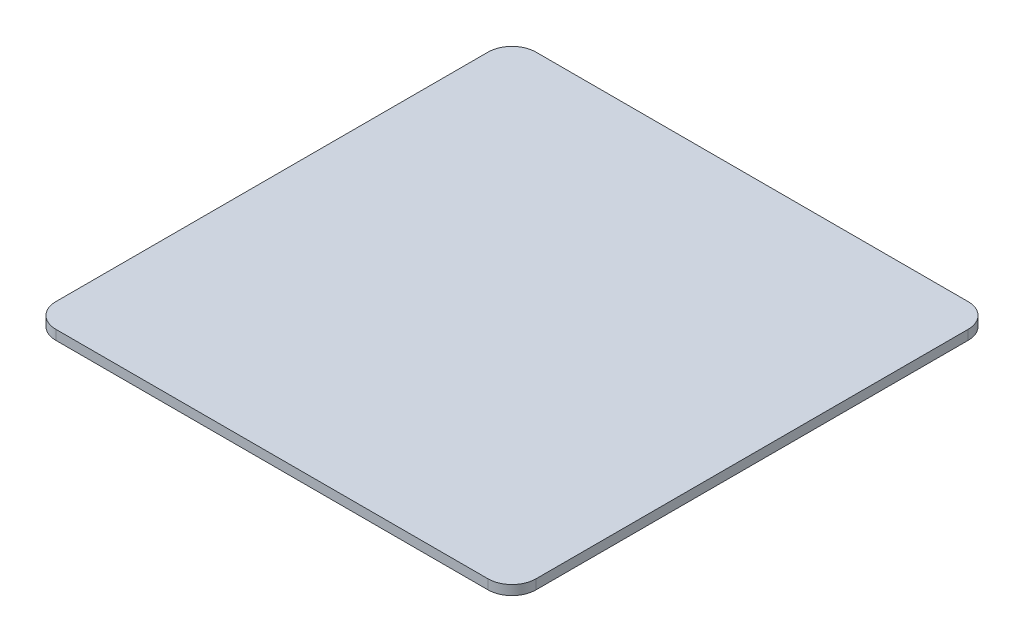
ISO-10303-21;
HEADER;
FILE_DESCRIPTION(('STEP AP214'),'2;1');
FILE_NAME('part.step','',(''),(''),'','','');
FILE_SCHEMA(('AUTOMOTIVE_DESIGN { 1 0 10303 214 1 1 1 1 }'));
ENDSEC;
DATA;
#1=APPLICATION_CONTEXT('core data for automotive mechanical design processes');
#2=APPLICATION_PROTOCOL_DEFINITION('international standard','automotive_design',2000,#1);
#3=PRODUCT_CONTEXT('',#1,'mechanical');
#4=PRODUCT('Part','Part','',(#3));
#5=PRODUCT_RELATED_PRODUCT_CATEGORY('part','',(#4));
#6=PRODUCT_DEFINITION_FORMATION('','',#4);
#7=PRODUCT_DEFINITION_CONTEXT('part definition',#1,'design');
#8=PRODUCT_DEFINITION('design','',#6,#7);
#9=PRODUCT_DEFINITION_SHAPE('','',#8);
#10=(LENGTH_UNIT() NAMED_UNIT(*) SI_UNIT(.MILLI.,.METRE.));
#11=(NAMED_UNIT(*) PLANE_ANGLE_UNIT() SI_UNIT($,.RADIAN.));
#12=(NAMED_UNIT(*) SI_UNIT($,.STERADIAN.) SOLID_ANGLE_UNIT());
#13=UNCERTAINTY_MEASURE_WITH_UNIT(LENGTH_MEASURE(1.E-05),#10,'distance_accuracy_value','');
#14=(GEOMETRIC_REPRESENTATION_CONTEXT(3) GLOBAL_UNCERTAINTY_ASSIGNED_CONTEXT((#13)) GLOBAL_UNIT_ASSIGNED_CONTEXT((#10,
#11,#12)) REPRESENTATION_CONTEXT('',''));
#15=CARTESIAN_POINT('',(0.,0.,0.));
#16=DIRECTION('',(0.,0.,1.));
#17=DIRECTION('',(1.,0.,0.));
#18=AXIS2_PLACEMENT_3D('',#15,#16,#17);
#19=CARTESIAN_POINT('',(25.,1.,25.));
#20=DIRECTION('',(-1.,0.,0.));
#21=DIRECTION('',(0.,0.,1.));
#22=AXIS2_PLACEMENT_3D('',#19,#20,#21);
#23=PLANE('',#22);
#24=DIRECTION('',(0.,0.,-1.));
#25=VECTOR('',#24,1.);
#26=CARTESIAN_POINT('',(25.,0.,25.));
#27=LINE('',#26,#25);
#28=CARTESIAN_POINT('',(25.,0.,22.5));
#29=VERTEX_POINT('',#28);
#30=CARTESIAN_POINT('',(25.,0.,-22.5));
#31=VERTEX_POINT('',#30);
#32=EDGE_CURVE('E140',#29,#31,#27,.T.);
#33=ORIENTED_EDGE('',*,*,#32,.T.);
#34=DIRECTION('',(0.,-1.,0.));
#35=VECTOR('',#34,1.);
#36=CARTESIAN_POINT('',(25.,1.,-22.5));
#37=LINE('',#36,#35);
#38=CARTESIAN_POINT('',(25.,1.,-22.5));
#39=VERTEX_POINT('',#38);
#40=EDGE_CURVE('E174',#31,#39,#37,.F.);
#41=ORIENTED_EDGE('',*,*,#40,.T.);
#42=DIRECTION('',(0.,0.,-1.));
#43=VECTOR('',#42,1.);
#44=CARTESIAN_POINT('',(25.,1.,25.));
#45=LINE('',#44,#43);
#46=CARTESIAN_POINT('',(25.,1.,22.5));
#47=VERTEX_POINT('',#46);
#48=EDGE_CURVE('E138',#47,#39,#45,.T.);
#49=ORIENTED_EDGE('',*,*,#48,.F.);
#50=DIRECTION('',(0.,-1.,0.));
#51=VECTOR('',#50,1.);
#52=CARTESIAN_POINT('',(25.,1.,22.5));
#53=LINE('',#52,#51);
#54=EDGE_CURVE('E170',#47,#29,#53,.T.);
#55=ORIENTED_EDGE('',*,*,#54,.T.);
#56=EDGE_LOOP('',(#33,#41,#49,#55));
#57=FACE_BOUND('',#56,.T.);
#58=ADVANCED_FACE('F39',(#57),#23,.F.);
#59=CARTESIAN_POINT('',(-25.,1.,-25.));
#60=DIRECTION('',(0.,0.,1.));
#61=DIRECTION('',(1.,0.,0.));
#62=AXIS2_PLACEMENT_3D('',#59,#60,#61);
#63=PLANE('',#62);
#64=DIRECTION('',(-1.,0.,0.));
#65=VECTOR('',#64,1.);
#66=CARTESIAN_POINT('',(-25.,0.,-25.));
#67=LINE('',#66,#65);
#68=CARTESIAN_POINT('',(22.5,0.,-25.));
#69=VERTEX_POINT('',#68);
#70=CARTESIAN_POINT('',(-22.5,0.,-25.));
#71=VERTEX_POINT('',#70);
#72=EDGE_CURVE('E134',#69,#71,#67,.T.);
#73=ORIENTED_EDGE('',*,*,#72,.T.);
#74=DIRECTION('',(0.,-1.,0.));
#75=VECTOR('',#74,1.);
#76=CARTESIAN_POINT('',(-22.5,1.,-25.));
#77=LINE('',#76,#75);
#78=CARTESIAN_POINT('',(-22.5,1.,-25.));
#79=VERTEX_POINT('',#78);
#80=EDGE_CURVE('E110',#71,#79,#77,.F.);
#81=ORIENTED_EDGE('',*,*,#80,.T.);
#82=DIRECTION('',(-1.,0.,0.));
#83=VECTOR('',#82,1.);
#84=CARTESIAN_POINT('',(-25.,1.,-25.));
#85=LINE('',#84,#83);
#86=CARTESIAN_POINT('',(22.5,1.,-25.));
#87=VERTEX_POINT('',#86);
#88=EDGE_CURVE('E193',#87,#79,#85,.T.);
#89=ORIENTED_EDGE('',*,*,#88,.F.);
#90=DIRECTION('',(0.,-1.,0.));
#91=VECTOR('',#90,1.);
#92=CARTESIAN_POINT('',(22.5,1.,-25.));
#93=LINE('',#92,#91);
#94=EDGE_CURVE('E116',#87,#69,#93,.T.);
#95=ORIENTED_EDGE('',*,*,#94,.T.);
#96=EDGE_LOOP('',(#73,#81,#89,#95));
#97=FACE_BOUND('',#96,.T.);
#98=ADVANCED_FACE('F214',(#97),#63,.F.);
#99=CARTESIAN_POINT('',(-25.,1.,25.));
#100=DIRECTION('',(1.,0.,0.));
#101=DIRECTION('',(0.,0.,-1.));
#102=AXIS2_PLACEMENT_3D('',#99,#100,#101);
#103=PLANE('',#102);
#104=DIRECTION('',(0.,0.,1.));
#105=VECTOR('',#104,1.);
#106=CARTESIAN_POINT('',(-25.,1.,25.));
#107=LINE('',#106,#105);
#108=CARTESIAN_POINT('',(-25.,1.,-22.5));
#109=VERTEX_POINT('',#108);
#110=CARTESIAN_POINT('',(-25.,1.,22.5));
#111=VERTEX_POINT('',#110);
#112=EDGE_CURVE('E125',#109,#111,#107,.T.);
#113=ORIENTED_EDGE('',*,*,#112,.F.);
#114=DIRECTION('',(0.,-1.,0.));
#115=VECTOR('',#114,1.);
#116=CARTESIAN_POINT('',(-25.,1.,-22.5));
#117=LINE('',#116,#115);
#118=CARTESIAN_POINT('',(-25.,0.,-22.5));
#119=VERTEX_POINT('',#118);
#120=EDGE_CURVE('E109',#109,#119,#117,.T.);
#121=ORIENTED_EDGE('',*,*,#120,.T.);
#122=DIRECTION('',(0.,0.,1.));
#123=VECTOR('',#122,1.);
#124=CARTESIAN_POINT('',(-25.,0.,25.));
#125=LINE('',#124,#123);
#126=CARTESIAN_POINT('',(-25.,0.,22.5));
#127=VERTEX_POINT('',#126);
#128=EDGE_CURVE('E123',#119,#127,#125,.T.);
#129=ORIENTED_EDGE('',*,*,#128,.T.);
#130=DIRECTION('',(0.,-1.,0.));
#131=VECTOR('',#130,1.);
#132=CARTESIAN_POINT('',(-25.,1.,22.5));
#133=LINE('',#132,#131);
#134=EDGE_CURVE('E128',#127,#111,#133,.F.);
#135=ORIENTED_EDGE('',*,*,#134,.T.);
#136=EDGE_LOOP('',(#113,#121,#129,#135));
#137=FACE_BOUND('',#136,.T.);
#138=ADVANCED_FACE('F122',(#137),#103,.F.);
#139=CARTESIAN_POINT('',(-25.,1.,25.));
#140=DIRECTION('',(0.,0.,-1.));
#141=DIRECTION('',(-1.,0.,0.));
#142=AXIS2_PLACEMENT_3D('',#139,#140,#141);
#143=PLANE('',#142);
#144=DIRECTION('',(1.,0.,0.));
#145=VECTOR('',#144,1.);
#146=CARTESIAN_POINT('',(-25.,0.,25.));
#147=LINE('',#146,#145);
#148=CARTESIAN_POINT('',(-22.5,0.,25.));
#149=VERTEX_POINT('',#148);
#150=CARTESIAN_POINT('',(22.5,0.,25.));
#151=VERTEX_POINT('',#150);
#152=EDGE_CURVE('E133',#149,#151,#147,.T.);
#153=ORIENTED_EDGE('',*,*,#152,.T.);
#154=DIRECTION('',(0.,-1.,0.));
#155=VECTOR('',#154,1.);
#156=CARTESIAN_POINT('',(22.5,1.,25.));
#157=LINE('',#156,#155);
#158=CARTESIAN_POINT('',(22.5,1.,25.));
#159=VERTEX_POINT('',#158);
#160=EDGE_CURVE('E11',#151,#159,#157,.F.);
#161=ORIENTED_EDGE('',*,*,#160,.T.);
#162=DIRECTION('',(1.,0.,0.));
#163=VECTOR('',#162,1.);
#164=CARTESIAN_POINT('',(-25.,1.,25.));
#165=LINE('',#164,#163);
#166=CARTESIAN_POINT('',(-22.5,1.,25.));
#167=VERTEX_POINT('',#166);
#168=EDGE_CURVE('E145',#167,#159,#165,.T.);
#169=ORIENTED_EDGE('',*,*,#168,.F.);
#170=DIRECTION('',(0.,-1.,0.));
#171=VECTOR('',#170,1.);
#172=CARTESIAN_POINT('',(-22.5,1.,25.));
#173=LINE('',#172,#171);
#174=EDGE_CURVE('E48',#167,#149,#173,.T.);
#175=ORIENTED_EDGE('',*,*,#174,.T.);
#176=EDGE_LOOP('',(#153,#161,#169,#175));
#177=FACE_BOUND('',#176,.T.);
#178=ADVANCED_FACE('F179',(#177),#143,.F.);
#179=CARTESIAN_POINT('',(0.,1.,0.));
#180=DIRECTION('',(0.,-1.,0.));
#181=DIRECTION('',(0.,0.,-1.));
#182=AXIS2_PLACEMENT_3D('',#179,#180,#181);
#183=PLANE('',#182);
#184=ORIENTED_EDGE('',*,*,#88,.T.);
#185=CARTESIAN_POINT('',(-22.5,1.,-22.5));
#186=DIRECTION('',(0.,-1.,0.));
#187=DIRECTION('',(0.,0.,-1.));
#188=AXIS2_PLACEMENT_3D('',#185,#186,#187);
#189=CIRCLE('',#188,2.5);
#190=EDGE_CURVE('E167',#79,#109,#189,.F.);
#191=ORIENTED_EDGE('',*,*,#190,.T.);
#192=ORIENTED_EDGE('',*,*,#112,.T.);
#193=CARTESIAN_POINT('',(-22.5,1.,22.5));
#194=DIRECTION('',(0.,-1.,0.));
#195=DIRECTION('',(0.,0.,-1.));
#196=AXIS2_PLACEMENT_3D('',#193,#194,#195);
#197=CIRCLE('',#196,2.5);
#198=EDGE_CURVE('E60',#111,#167,#197,.F.);
#199=ORIENTED_EDGE('',*,*,#198,.T.);
#200=ORIENTED_EDGE('',*,*,#168,.T.);
#201=CARTESIAN_POINT('',(22.5,1.,22.5));
#202=DIRECTION('',(0.,-1.,0.));
#203=DIRECTION('',(0.,0.,-1.));
#204=AXIS2_PLACEMENT_3D('',#201,#202,#203);
#205=CIRCLE('',#204,2.5);
#206=EDGE_CURVE('E161',#159,#47,#205,.F.);
#207=ORIENTED_EDGE('',*,*,#206,.T.);
#208=ORIENTED_EDGE('',*,*,#48,.T.);
#209=CARTESIAN_POINT('',(22.5,1.,-22.5));
#210=DIRECTION('',(0.,-1.,0.));
#211=DIRECTION('',(0.,0.,-1.));
#212=AXIS2_PLACEMENT_3D('',#209,#210,#211);
#213=CIRCLE('',#212,2.5);
#214=EDGE_CURVE('E164',#39,#87,#213,.F.);
#215=ORIENTED_EDGE('',*,*,#214,.T.);
#216=EDGE_LOOP('',(#184,#191,#192,#199,#200,#207,#208,#215));
#217=FACE_BOUND('',#216,.T.);
#218=ADVANCED_FACE('F203',(#217),#183,.F.);
#219=CARTESIAN_POINT('',(0.,0.,0.));
#220=DIRECTION('',(0.,-1.,0.));
#221=DIRECTION('',(0.,0.,-1.));
#222=AXIS2_PLACEMENT_3D('',#219,#220,#221);
#223=PLANE('',#222);
#224=ORIENTED_EDGE('',*,*,#128,.F.);
#225=CARTESIAN_POINT('',(-22.5,0.,-22.5));
#226=DIRECTION('',(0.,-1.,0.));
#227=DIRECTION('',(0.,0.,-1.));
#228=AXIS2_PLACEMENT_3D('',#225,#226,#227);
#229=CIRCLE('',#228,2.5);
#230=EDGE_CURVE('E105',#119,#71,#229,.T.);
#231=ORIENTED_EDGE('',*,*,#230,.T.);
#232=ORIENTED_EDGE('',*,*,#72,.F.);
#233=CARTESIAN_POINT('',(22.5,0.,-22.5));
#234=DIRECTION('',(0.,-1.,0.));
#235=DIRECTION('',(0.,0.,-1.));
#236=AXIS2_PLACEMENT_3D('',#233,#234,#235);
#237=CIRCLE('',#236,2.5);
#238=EDGE_CURVE('E117',#69,#31,#237,.T.);
#239=ORIENTED_EDGE('',*,*,#238,.T.);
#240=ORIENTED_EDGE('',*,*,#32,.F.);
#241=CARTESIAN_POINT('',(22.5,0.,22.5));
#242=DIRECTION('',(0.,-1.,0.));
#243=DIRECTION('',(0.,0.,-1.));
#244=AXIS2_PLACEMENT_3D('',#241,#242,#243);
#245=CIRCLE('',#244,2.5);
#246=EDGE_CURVE('E149',#29,#151,#245,.T.);
#247=ORIENTED_EDGE('',*,*,#246,.T.);
#248=ORIENTED_EDGE('',*,*,#152,.F.);
#249=CARTESIAN_POINT('',(-22.5,0.,22.5));
#250=DIRECTION('',(0.,-1.,0.));
#251=DIRECTION('',(0.,0.,-1.));
#252=AXIS2_PLACEMENT_3D('',#249,#250,#251);
#253=CIRCLE('',#252,2.5);
#254=EDGE_CURVE('E127',#149,#127,#253,.T.);
#255=ORIENTED_EDGE('',*,*,#254,.T.);
#256=EDGE_LOOP('',(#224,#231,#232,#239,#240,#247,#248,#255));
#257=FACE_BOUND('',#256,.T.);
#258=ADVANCED_FACE('F130',(#257),#223,.T.);
#259=CARTESIAN_POINT('',(-22.5,1.,-22.5));
#260=DIRECTION('',(0.,-1.,0.));
#261=DIRECTION('',(0.,0.,-1.));
#262=AXIS2_PLACEMENT_3D('',#259,#260,#261);
#263=CYLINDRICAL_SURFACE('',#262,2.5);
#264=ORIENTED_EDGE('',*,*,#190,.F.);
#265=ORIENTED_EDGE('',*,*,#80,.F.);
#266=ORIENTED_EDGE('',*,*,#230,.F.);
#267=ORIENTED_EDGE('',*,*,#120,.F.);
#268=EDGE_LOOP('',(#264,#265,#266,#267));
#269=FACE_BOUND('',#268,.T.);
#270=ADVANCED_FACE('F108',(#269),#263,.T.);
#271=CARTESIAN_POINT('',(22.5,1.,-22.5));
#272=DIRECTION('',(0.,-1.,0.));
#273=DIRECTION('',(0.,0.,-1.));
#274=AXIS2_PLACEMENT_3D('',#271,#272,#273);
#275=CYLINDRICAL_SURFACE('',#274,2.5);
#276=ORIENTED_EDGE('',*,*,#214,.F.);
#277=ORIENTED_EDGE('',*,*,#40,.F.);
#278=ORIENTED_EDGE('',*,*,#238,.F.);
#279=ORIENTED_EDGE('',*,*,#94,.F.);
#280=EDGE_LOOP('',(#276,#277,#278,#279));
#281=FACE_BOUND('',#280,.T.);
#282=ADVANCED_FACE('F225',(#281),#275,.T.);
#283=CARTESIAN_POINT('',(22.5,1.,22.5));
#284=DIRECTION('',(0.,-1.,0.));
#285=DIRECTION('',(0.,0.,-1.));
#286=AXIS2_PLACEMENT_3D('',#283,#284,#285);
#287=CYLINDRICAL_SURFACE('',#286,2.5);
#288=ORIENTED_EDGE('',*,*,#206,.F.);
#289=ORIENTED_EDGE('',*,*,#160,.F.);
#290=ORIENTED_EDGE('',*,*,#246,.F.);
#291=ORIENTED_EDGE('',*,*,#54,.F.);
#292=EDGE_LOOP('',(#288,#289,#290,#291));
#293=FACE_BOUND('',#292,.T.);
#294=ADVANCED_FACE('F186',(#293),#287,.T.);
#295=CARTESIAN_POINT('',(-22.5,1.,22.5));
#296=DIRECTION('',(0.,-1.,0.));
#297=DIRECTION('',(0.,0.,-1.));
#298=AXIS2_PLACEMENT_3D('',#295,#296,#297);
#299=CYLINDRICAL_SURFACE('',#298,2.5);
#300=ORIENTED_EDGE('',*,*,#198,.F.);
#301=ORIENTED_EDGE('',*,*,#134,.F.);
#302=ORIENTED_EDGE('',*,*,#254,.F.);
#303=ORIENTED_EDGE('',*,*,#174,.F.);
#304=EDGE_LOOP('',(#300,#301,#302,#303));
#305=FACE_BOUND('',#304,.T.);
#306=ADVANCED_FACE('F41',(#305),#299,.T.);
#307=CLOSED_SHELL('',(#58,#98,#138,#178,#218,#258,#270,#282,#294,#306));
#308=MANIFOLD_SOLID_BREP('B2',#307);
#309=ADVANCED_BREP_SHAPE_REPRESENTATION('',(#18,#308),#14);
#310=SHAPE_DEFINITION_REPRESENTATION(#9,#309);
ENDSEC;
END-ISO-10303-21;
